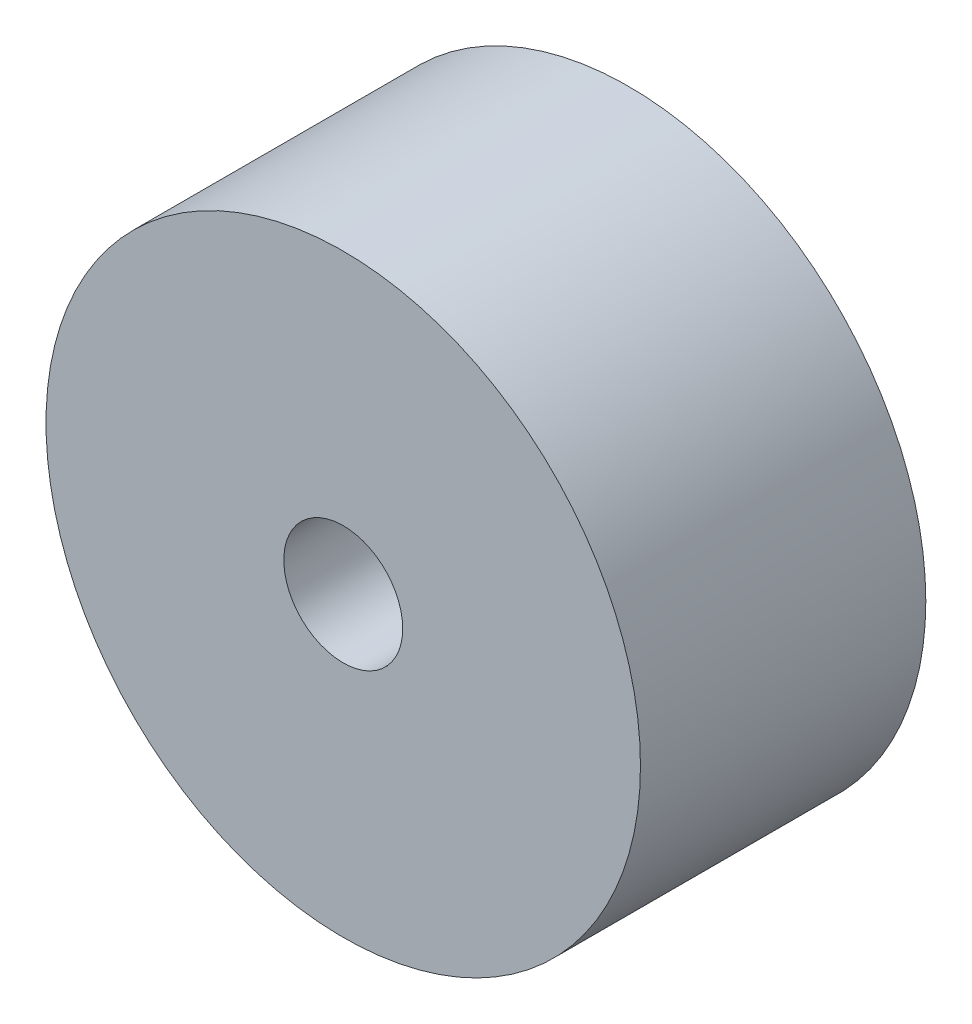
ISO-10303-21;
HEADER;
FILE_DESCRIPTION(('STEP AP214'),'2;1');
FILE_NAME('part.step','',(''),(''),'','','');
FILE_SCHEMA(('AUTOMOTIVE_DESIGN { 1 0 10303 214 1 1 1 1 }'));
ENDSEC;
DATA;
#1=APPLICATION_CONTEXT('core data for automotive mechanical design processes');
#2=APPLICATION_PROTOCOL_DEFINITION('international standard','automotive_design',2000,#1);
#3=PRODUCT_CONTEXT('',#1,'mechanical');
#4=PRODUCT('Part','Part','',(#3));
#5=PRODUCT_RELATED_PRODUCT_CATEGORY('part','',(#4));
#6=PRODUCT_DEFINITION_FORMATION('','',#4);
#7=PRODUCT_DEFINITION_CONTEXT('part definition',#1,'design');
#8=PRODUCT_DEFINITION('design','',#6,#7);
#9=PRODUCT_DEFINITION_SHAPE('','',#8);
#10=(LENGTH_UNIT() NAMED_UNIT(*) SI_UNIT(.MILLI.,.METRE.));
#11=(NAMED_UNIT(*) PLANE_ANGLE_UNIT() SI_UNIT($,.RADIAN.));
#12=(NAMED_UNIT(*) SI_UNIT($,.STERADIAN.) SOLID_ANGLE_UNIT());
#13=UNCERTAINTY_MEASURE_WITH_UNIT(LENGTH_MEASURE(1.E-05),#10,'distance_accuracy_value','');
#14=(GEOMETRIC_REPRESENTATION_CONTEXT(3) GLOBAL_UNCERTAINTY_ASSIGNED_CONTEXT((#13)) GLOBAL_UNIT_ASSIGNED_CONTEXT((#10,
#11,#12)) REPRESENTATION_CONTEXT('',''));
#15=CARTESIAN_POINT('',(0.,0.,0.));
#16=DIRECTION('',(0.,0.,1.));
#17=DIRECTION('',(1.,0.,0.));
#18=AXIS2_PLACEMENT_3D('',#15,#16,#17);
#19=CARTESIAN_POINT('',(12.5087,12.5087,0.00870000000009));
#20=DIRECTION('',(0.,0.,1.));
#21=DIRECTION('',(1.,0.,0.));
#22=AXIS2_PLACEMENT_3D('',#19,#20,#21);
#23=CYLINDRICAL_SURFACE('',#22,2.5);
#24=CARTESIAN_POINT('',(12.5087,12.5087,0.00870000000009));
#25=DIRECTION('',(0.,0.,1.));
#26=DIRECTION('',(1.,0.,0.));
#27=AXIS2_PLACEMENT_3D('',#24,#25,#26);
#28=CIRCLE('',#27,2.5);
#29=CARTESIAN_POINT('',(15.0087,12.5087,0.00870000000009));
#30=VERTEX_POINT('',#29);
#31=EDGE_CURVE('E25',#30,#30,#28,.F.);
#32=ORIENTED_EDGE('',*,*,#31,.T.);
#33=EDGE_LOOP('',(#32));
#34=FACE_BOUND('',#33,.T.);
#35=CARTESIAN_POINT('',(12.5087,12.5087,12.0087));
#36=DIRECTION('',(0.,0.,1.));
#37=DIRECTION('',(1.,0.,0.));
#38=AXIS2_PLACEMENT_3D('',#35,#36,#37);
#39=CIRCLE('',#38,2.5);
#40=CARTESIAN_POINT('',(15.0087,12.5087,12.0087));
#41=VERTEX_POINT('',#40);
#42=EDGE_CURVE('E16',#41,#41,#39,.F.);
#43=ORIENTED_EDGE('',*,*,#42,.F.);
#44=EDGE_LOOP('',(#43));
#45=FACE_BOUND('',#44,.T.);
#46=ADVANCED_FACE('F13',(#34,#45),#23,.F.);
#47=CARTESIAN_POINT('',(12.5087,12.5087,12.0087));
#48=DIRECTION('',(0.,0.,1.));
#49=DIRECTION('',(1.,0.,0.));
#50=AXIS2_PLACEMENT_3D('',#47,#48,#49);
#51=PLANE('',#50);
#52=ORIENTED_EDGE('',*,*,#42,.T.);
#53=EDGE_LOOP('',(#52));
#54=FACE_BOUND('',#53,.T.);
#55=CARTESIAN_POINT('',(12.5087,12.5087,12.0087));
#56=DIRECTION('',(0.,0.,1.));
#57=DIRECTION('',(1.,0.,0.));
#58=AXIS2_PLACEMENT_3D('',#55,#56,#57);
#59=CIRCLE('',#58,12.5);
#60=CARTESIAN_POINT('',(25.0087,12.5087,12.0087));
#61=VERTEX_POINT('',#60);
#62=EDGE_CURVE('E20',#61,#61,#59,.F.);
#63=ORIENTED_EDGE('',*,*,#62,.F.);
#64=EDGE_LOOP('',(#63));
#65=FACE_BOUND('',#64,.T.);
#66=ADVANCED_FACE('F33',(#54,#65),#51,.T.);
#67=CARTESIAN_POINT('',(12.5087,12.5087,0.00870000000009));
#68=DIRECTION('',(0.,0.,1.));
#69=DIRECTION('',(1.,0.,0.));
#70=AXIS2_PLACEMENT_3D('',#67,#68,#69);
#71=PLANE('',#70);
#72=ORIENTED_EDGE('',*,*,#31,.F.);
#73=EDGE_LOOP('',(#72));
#74=FACE_BOUND('',#73,.T.);
#75=CARTESIAN_POINT('',(12.5087,12.5087,0.00870000000009));
#76=DIRECTION('',(0.,0.,1.));
#77=DIRECTION('',(1.,0.,0.));
#78=AXIS2_PLACEMENT_3D('',#75,#76,#77);
#79=CIRCLE('',#78,12.5);
#80=CARTESIAN_POINT('',(25.0087,12.5087,0.00870000000009));
#81=VERTEX_POINT('',#80);
#82=EDGE_CURVE('E8',#81,#81,#79,.T.);
#83=ORIENTED_EDGE('',*,*,#82,.F.);
#84=EDGE_LOOP('',(#83));
#85=FACE_BOUND('',#84,.T.);
#86=ADVANCED_FACE('F41',(#74,#85),#71,.F.);
#87=CARTESIAN_POINT('',(12.5087,12.5087,0.00870000000009));
#88=DIRECTION('',(0.,0.,1.));
#89=DIRECTION('',(1.,0.,0.));
#90=AXIS2_PLACEMENT_3D('',#87,#88,#89);
#91=CYLINDRICAL_SURFACE('',#90,12.5);
#92=ORIENTED_EDGE('',*,*,#82,.T.);
#93=EDGE_LOOP('',(#92));
#94=FACE_BOUND('',#93,.T.);
#95=ORIENTED_EDGE('',*,*,#62,.T.);
#96=EDGE_LOOP('',(#95));
#97=FACE_BOUND('',#96,.T.);
#98=ADVANCED_FACE('F42',(#94,#97),#91,.T.);
#99=CLOSED_SHELL('',(#46,#66,#86,#98));
#100=MANIFOLD_SOLID_BREP('B1',#99);
#101=ADVANCED_BREP_SHAPE_REPRESENTATION('',(#18,#100),#14);
#102=SHAPE_DEFINITION_REPRESENTATION(#9,#101);
ENDSEC;
END-ISO-10303-21;
